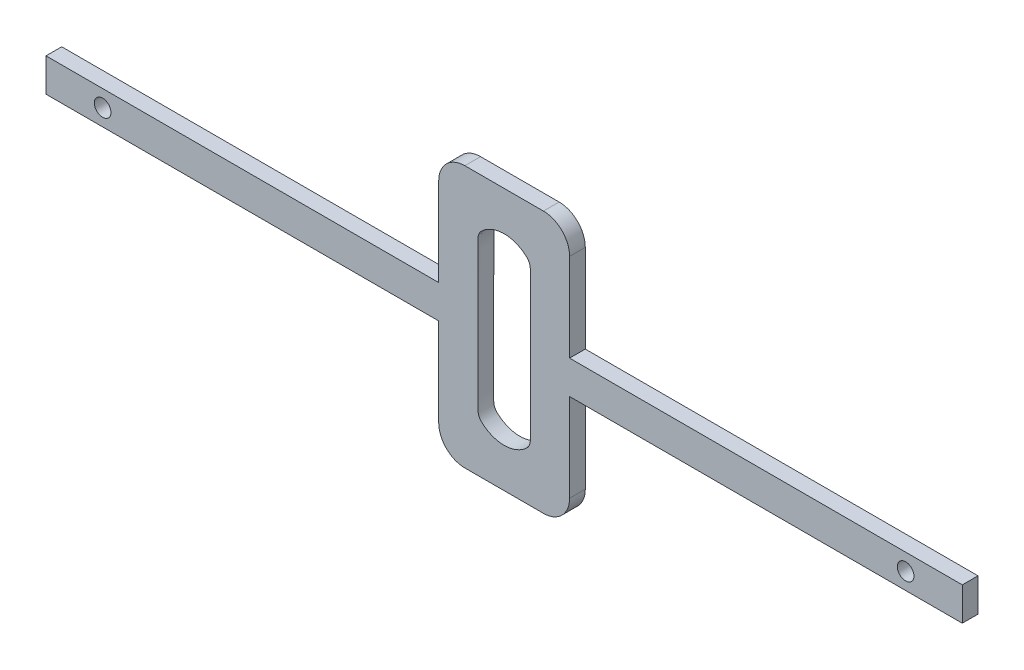
ISO-10303-21;
HEADER;
FILE_DESCRIPTION(('STEP AP214'),'2;1');
FILE_NAME('part.step','',(''),(''),'','','');
FILE_SCHEMA(('AUTOMOTIVE_DESIGN { 1 0 10303 214 1 1 1 1 }'));
ENDSEC;
DATA;
#1=APPLICATION_CONTEXT('core data for automotive mechanical design processes');
#2=APPLICATION_PROTOCOL_DEFINITION('international standard','automotive_design',2000,#1);
#3=PRODUCT_CONTEXT('',#1,'mechanical');
#4=PRODUCT('Part','Part','',(#3));
#5=PRODUCT_RELATED_PRODUCT_CATEGORY('part','',(#4));
#6=PRODUCT_DEFINITION_FORMATION('','',#4);
#7=PRODUCT_DEFINITION_CONTEXT('part definition',#1,'design');
#8=PRODUCT_DEFINITION('design','',#6,#7);
#9=PRODUCT_DEFINITION_SHAPE('','',#8);
#10=(LENGTH_UNIT() NAMED_UNIT(*) SI_UNIT(.MILLI.,.METRE.));
#11=(NAMED_UNIT(*) PLANE_ANGLE_UNIT() SI_UNIT($,.RADIAN.));
#12=(NAMED_UNIT(*) SI_UNIT($,.STERADIAN.) SOLID_ANGLE_UNIT());
#13=UNCERTAINTY_MEASURE_WITH_UNIT(LENGTH_MEASURE(1.E-05),#10,'distance_accuracy_value','');
#14=(GEOMETRIC_REPRESENTATION_CONTEXT(3) GLOBAL_UNCERTAINTY_ASSIGNED_CONTEXT((#13)) GLOBAL_UNIT_ASSIGNED_CONTEXT((#10,
#11,#12)) REPRESENTATION_CONTEXT('',''));
#15=CARTESIAN_POINT('',(0.,0.,0.));
#16=DIRECTION('',(0.,0.,1.));
#17=DIRECTION('',(1.,0.,0.));
#18=AXIS2_PLACEMENT_3D('',#15,#16,#17);
#19=CARTESIAN_POINT('',(-25.,-39.9999999999999,6.));
#20=DIRECTION('',(1.,0.,0.));
#21=DIRECTION('',(0.,0.,-1.));
#22=AXIS2_PLACEMENT_3D('',#19,#20,#21);
#23=PLANE('',#22);
#24=DIRECTION('',(0.,-1.,0.));
#25=VECTOR('',#24,1.);
#26=CARTESIAN_POINT('',(-25.,-39.9999999999999,6.));
#27=LINE('',#26,#25);
#28=CARTESIAN_POINT('',(-25.,-6.35,6.));
#29=VERTEX_POINT('',#28);
#30=CARTESIAN_POINT('',(-25.,-40.,6.));
#31=VERTEX_POINT('',#30);
#32=EDGE_CURVE('E276',#29,#31,#27,.T.);
#33=ORIENTED_EDGE('',*,*,#32,.F.);
#34=DIRECTION('',(0.,0.,-1.));
#35=VECTOR('',#34,1.);
#36=CARTESIAN_POINT('',(-25.,-6.35,6.));
#37=LINE('',#36,#35);
#38=CARTESIAN_POINT('',(-25.,-6.35,0.));
#39=VERTEX_POINT('',#38);
#40=EDGE_CURVE('E180',#29,#39,#37,.T.);
#41=ORIENTED_EDGE('',*,*,#40,.T.);
#42=DIRECTION('',(0.,-1.,0.));
#43=VECTOR('',#42,1.);
#44=CARTESIAN_POINT('',(-25.,-39.9999999999999,0.));
#45=LINE('',#44,#43);
#46=CARTESIAN_POINT('',(-25.,-40.,0.));
#47=VERTEX_POINT('',#46);
#48=EDGE_CURVE('E155',#39,#47,#45,.T.);
#49=ORIENTED_EDGE('',*,*,#48,.T.);
#50=DIRECTION('',(0.,0.,-1.));
#51=VECTOR('',#50,1.);
#52=CARTESIAN_POINT('',(-25.,-40.,6.));
#53=LINE('',#52,#51);
#54=EDGE_CURVE('E278',#31,#47,#53,.T.);
#55=ORIENTED_EDGE('',*,*,#54,.F.);
#56=EDGE_LOOP('',(#33,#41,#49,#55));
#57=FACE_BOUND('',#56,.T.);
#58=ADVANCED_FACE('F33',(#57),#23,.F.);
#59=CARTESIAN_POINT('',(25.,-39.9999999999999,6.));
#60=DIRECTION('',(-1.,0.,0.));
#61=DIRECTION('',(0.,0.,1.));
#62=AXIS2_PLACEMENT_3D('',#59,#60,#61);
#63=PLANE('',#62);
#64=DIRECTION('',(0.,0.,1.));
#65=VECTOR('',#64,1.);
#66=CARTESIAN_POINT('',(25.,6.35,6.));
#67=LINE('',#66,#65);
#68=CARTESIAN_POINT('',(25.,6.35,0.));
#69=VERTEX_POINT('',#68);
#70=CARTESIAN_POINT('',(25.,6.35,6.));
#71=VERTEX_POINT('',#70);
#72=EDGE_CURVE('E160',#69,#71,#67,.T.);
#73=ORIENTED_EDGE('',*,*,#72,.F.);
#74=DIRECTION('',(0.,1.,0.));
#75=VECTOR('',#74,1.);
#76=CARTESIAN_POINT('',(25.,-39.9999999999999,0.));
#77=LINE('',#76,#75);
#78=CARTESIAN_POINT('',(25.,39.9999999999999,0.));
#79=VERTEX_POINT('',#78);
#80=EDGE_CURVE('E314',#69,#79,#77,.T.);
#81=ORIENTED_EDGE('',*,*,#80,.T.);
#82=DIRECTION('',(0.,0.,-1.));
#83=VECTOR('',#82,1.);
#84=CARTESIAN_POINT('',(25.,39.9999999999999,6.));
#85=LINE('',#84,#83);
#86=CARTESIAN_POINT('',(25.,39.9999999999999,6.));
#87=VERTEX_POINT('',#86);
#88=EDGE_CURVE('E298',#87,#79,#85,.T.);
#89=ORIENTED_EDGE('',*,*,#88,.F.);
#90=DIRECTION('',(0.,1.,0.));
#91=VECTOR('',#90,1.);
#92=CARTESIAN_POINT('',(25.,-39.9999999999999,6.));
#93=LINE('',#92,#91);
#94=EDGE_CURVE('E56',#71,#87,#93,.T.);
#95=ORIENTED_EDGE('',*,*,#94,.F.);
#96=EDGE_LOOP('',(#73,#81,#89,#95));
#97=FACE_BOUND('',#96,.T.);
#98=ADVANCED_FACE('F242',(#97),#63,.F.);
#99=DIRECTION('',(0.,0.,-1.));
#100=VECTOR('',#99,1.);
#101=CARTESIAN_POINT('',(25.,-6.35,6.));
#102=LINE('',#101,#100);
#103=CARTESIAN_POINT('',(25.,-6.35,6.));
#104=VERTEX_POINT('',#103);
#105=CARTESIAN_POINT('',(25.,-6.35,0.));
#106=VERTEX_POINT('',#105);
#107=EDGE_CURVE('E191',#104,#106,#102,.T.);
#108=ORIENTED_EDGE('',*,*,#107,.F.);
#109=CARTESIAN_POINT('',(25.,-39.9999999999999,6.));
#110=VERTEX_POINT('',#109);
#111=EDGE_CURVE('E295',#110,#104,#93,.T.);
#112=ORIENTED_EDGE('',*,*,#111,.F.);
#113=DIRECTION('',(0.,0.,-1.));
#114=VECTOR('',#113,1.);
#115=CARTESIAN_POINT('',(25.,-39.9999999999999,6.));
#116=LINE('',#115,#114);
#117=CARTESIAN_POINT('',(25.,-39.9999999999999,0.));
#118=VERTEX_POINT('',#117);
#119=EDGE_CURVE('E320',#110,#118,#116,.T.);
#120=ORIENTED_EDGE('',*,*,#119,.T.);
#121=EDGE_CURVE('E315',#118,#106,#77,.T.);
#122=ORIENTED_EDGE('',*,*,#121,.T.);
#123=EDGE_LOOP('',(#108,#112,#120,#122));
#124=FACE_BOUND('',#123,.T.);
#125=ADVANCED_FACE('F237',(#124),#63,.F.);
#126=CARTESIAN_POINT('',(15.,40.,6.));
#127=DIRECTION('',(0.,0.,1.));
#128=DIRECTION('',(1.,0.,0.));
#129=AXIS2_PLACEMENT_3D('',#126,#127,#128);
#130=PLANE('',#129);
#131=CARTESIAN_POINT('',(153.359331414333,0.,6.));
#132=DIRECTION('',(0.,0.,1.));
#133=DIRECTION('',(-1.,0.,0.));
#134=AXIS2_PLACEMENT_3D('',#131,#132,#133);
#135=CIRCLE('',#134,3.175);
#136=CARTESIAN_POINT('',(150.184331414333,0.,6.));
#137=VERTEX_POINT('',#136);
#138=EDGE_CURVE('E524',#137,#137,#135,.T.);
#139=ORIENTED_EDGE('',*,*,#138,.F.);
#140=EDGE_LOOP('',(#139));
#141=FACE_BOUND('',#140,.T.);
#142=CARTESIAN_POINT('',(-153.359331414333,0.,6.));
#143=DIRECTION('',(0.,0.,1.));
#144=DIRECTION('',(1.,0.,0.));
#145=AXIS2_PLACEMENT_3D('',#142,#143,#144);
#146=CIRCLE('',#145,3.175);
#147=CARTESIAN_POINT('',(-150.184331414333,0.,6.));
#148=VERTEX_POINT('',#147);
#149=EDGE_CURVE('E526',#148,#148,#146,.T.);
#150=ORIENTED_EDGE('',*,*,#149,.F.);
#151=EDGE_LOOP('',(#150));
#152=FACE_BOUND('',#151,.T.);
#153=DIRECTION('',(-1.,0.,0.));
#154=VECTOR('',#153,1.);
#155=CARTESIAN_POINT('',(175.,6.35,6.));
#156=LINE('',#155,#154);
#157=CARTESIAN_POINT('',(175.,6.35,6.));
#158=VERTEX_POINT('',#157);
#159=EDGE_CURVE('E205',#158,#71,#156,.T.);
#160=ORIENTED_EDGE('',*,*,#159,.T.);
#161=ORIENTED_EDGE('',*,*,#94,.T.);
#162=CARTESIAN_POINT('',(15.,40.,6.));
#163=DIRECTION('',(0.,0.,1.));
#164=DIRECTION('',(1.,0.,0.));
#165=AXIS2_PLACEMENT_3D('',#162,#163,#164);
#166=CIRCLE('',#165,10.);
#167=CARTESIAN_POINT('',(14.9999999999999,50.,6.));
#168=VERTEX_POINT('',#167);
#169=EDGE_CURVE('E317',#87,#168,#166,.T.);
#170=ORIENTED_EDGE('',*,*,#169,.T.);
#171=DIRECTION('',(-1.,0.,0.));
#172=VECTOR('',#171,1.);
#173=CARTESIAN_POINT('',(14.9999999999999,50.,6.));
#174=LINE('',#173,#172);
#175=CARTESIAN_POINT('',(-14.9999999999999,50.,6.));
#176=VERTEX_POINT('',#175);
#177=EDGE_CURVE('E286',#168,#176,#174,.T.);
#178=ORIENTED_EDGE('',*,*,#177,.T.);
#179=CARTESIAN_POINT('',(-15.,40.,6.));
#180=DIRECTION('',(0.,0.,1.));
#181=DIRECTION('',(1.,0.,0.));
#182=AXIS2_PLACEMENT_3D('',#179,#180,#181);
#183=CIRCLE('',#182,10.);
#184=CARTESIAN_POINT('',(-25.,39.9999999999999,6.));
#185=VERTEX_POINT('',#184);
#186=EDGE_CURVE('E282',#176,#185,#183,.T.);
#187=ORIENTED_EDGE('',*,*,#186,.T.);
#188=CARTESIAN_POINT('',(-25.,6.35,6.));
#189=VERTEX_POINT('',#188);
#190=EDGE_CURVE('E281',#185,#189,#27,.T.);
#191=ORIENTED_EDGE('',*,*,#190,.T.);
#192=DIRECTION('',(1.,0.,0.));
#193=VECTOR('',#192,1.);
#194=CARTESIAN_POINT('',(-175.,6.35,6.));
#195=LINE('',#194,#193);
#196=CARTESIAN_POINT('',(-175.,6.35,6.));
#197=VERTEX_POINT('',#196);
#198=EDGE_CURVE('E48',#197,#189,#195,.T.);
#199=ORIENTED_EDGE('',*,*,#198,.F.);
#200=DIRECTION('',(0.,-1.,0.));
#201=VECTOR('',#200,1.);
#202=CARTESIAN_POINT('',(-175.,-6.35,6.));
#203=LINE('',#202,#201);
#204=CARTESIAN_POINT('',(-175.,-6.35,6.));
#205=VERTEX_POINT('',#204);
#206=EDGE_CURVE('E173',#197,#205,#203,.T.);
#207=ORIENTED_EDGE('',*,*,#206,.T.);
#208=DIRECTION('',(1.,0.,0.));
#209=VECTOR('',#208,1.);
#210=CARTESIAN_POINT('',(-175.,-6.35,6.));
#211=LINE('',#210,#209);
#212=EDGE_CURVE('E161',#205,#29,#211,.T.);
#213=ORIENTED_EDGE('',*,*,#212,.T.);
#214=ORIENTED_EDGE('',*,*,#32,.T.);
#215=CARTESIAN_POINT('',(-15.,-40.,6.));
#216=DIRECTION('',(0.,0.,1.));
#217=DIRECTION('',(-1.,0.,0.));
#218=AXIS2_PLACEMENT_3D('',#215,#216,#217);
#219=CIRCLE('',#218,10.);
#220=CARTESIAN_POINT('',(-14.9999999999999,-50.,6.));
#221=VERTEX_POINT('',#220);
#222=EDGE_CURVE('E285',#31,#221,#219,.T.);
#223=ORIENTED_EDGE('',*,*,#222,.T.);
#224=DIRECTION('',(1.,0.,0.));
#225=VECTOR('',#224,1.);
#226=CARTESIAN_POINT('',(14.9999999999999,-50.,6.));
#227=LINE('',#226,#225);
#228=CARTESIAN_POINT('',(14.9999999999999,-50.,6.));
#229=VERTEX_POINT('',#228);
#230=EDGE_CURVE('E291',#221,#229,#227,.T.);
#231=ORIENTED_EDGE('',*,*,#230,.T.);
#232=CARTESIAN_POINT('',(15.,-40.,6.));
#233=DIRECTION('',(0.,0.,1.));
#234=DIRECTION('',(1.,0.,0.));
#235=AXIS2_PLACEMENT_3D('',#232,#233,#234);
#236=CIRCLE('',#235,10.);
#237=EDGE_CURVE('E293',#229,#110,#236,.T.);
#238=ORIENTED_EDGE('',*,*,#237,.T.);
#239=ORIENTED_EDGE('',*,*,#111,.T.);
#240=DIRECTION('',(-1.,0.,0.));
#241=VECTOR('',#240,1.);
#242=CARTESIAN_POINT('',(175.,-6.35,6.));
#243=LINE('',#242,#241);
#244=CARTESIAN_POINT('',(175.,-6.35,6.));
#245=VERTEX_POINT('',#244);
#246=EDGE_CURVE('E202',#245,#104,#243,.T.);
#247=ORIENTED_EDGE('',*,*,#246,.F.);
#248=DIRECTION('',(0.,-1.,0.));
#249=VECTOR('',#248,1.);
#250=CARTESIAN_POINT('',(175.,-6.35,6.));
#251=LINE('',#250,#249);
#252=EDGE_CURVE('E193',#158,#245,#251,.T.);
#253=ORIENTED_EDGE('',*,*,#252,.F.);
#254=EDGE_LOOP('',(#160,#161,#170,#178,#187,#191,#199,#207,#213,#214,#223,#231,#238,#239,#247,#253));
#255=FACE_BOUND('',#254,.T.);
#256=CARTESIAN_POINT('',(-10.,-24.256176986316,6.));
#257=CARTESIAN_POINT('',(-10.,-24.6546797502891,6.));
#258=CARTESIAN_POINT('',(-10.,-25.4516852782352,6.));
#259=CARTESIAN_POINT('',(-10.,-26.6471935701544,6.));
#260=CARTESIAN_POINT('',(-10.,-27.4441990981005,6.));
#261=CARTESIAN_POINT('',(-10.,-27.8427018620735,6.));
#262=CARTESIAN_POINT('',(-10.,-28.3645798623704,6.));
#263=CARTESIAN_POINT('',(-10.,-29.4083358629641,6.));
#264=CARTESIAN_POINT('',(-9.21136120348822,-31.0937206496149,6.));
#265=CARTESIAN_POINT('',(-8.41001572821081,-31.7625046341927,6.));
#266=CARTESIAN_POINT('',(-8.0093429905721,-32.0968966264816,6.));
#267=CARTESIAN_POINT('',(-7.76269737408092,-32.3027412256771,6.));
#268=CARTESIAN_POINT('',(-7.26940614109857,-32.7144304240682,6.));
#269=CARTESIAN_POINT('',(-6.44111569163193,-33.2271739218832,6.));
#270=CARTESIAN_POINT('',(-5.87751093860023,-33.5366693900736,6.));
#271=CARTESIAN_POINT('',(-5.59016994374948,-33.680339887499,6.));
#272=CARTESIAN_POINT('',(-2.00446820738661,-35.4731907556804,6.));
#273=CARTESIAN_POINT('',(2.0044682073866,-35.4731907556804,6.));
#274=CARTESIAN_POINT('',(5.59016994374947,-33.680339887499,6.));
#275=CARTESIAN_POINT('',(5.87751093860022,-33.5366693900736,5.99999999999997));
#276=CARTESIAN_POINT('',(6.44111569163192,-33.2271739218832,5.99999999999997));
#277=CARTESIAN_POINT('',(7.26940614109856,-32.7144304240682,5.99999999999998));
#278=CARTESIAN_POINT('',(7.76269737408092,-32.3027412256771,5.99999999999998));
#279=CARTESIAN_POINT('',(8.00934299057209,-32.0968966264816,5.99999999999998));
#280=CARTESIAN_POINT('',(8.4100157282108,-31.7625046341927,5.99999999999998));
#281=CARTESIAN_POINT('',(9.21136120348822,-31.0937206496149,5.99999999999999));
#282=CARTESIAN_POINT('',(10.,-29.4083358629641,6.));
#283=CARTESIAN_POINT('',(10.,-28.3645798623704,6.00000000000001));
#284=CARTESIAN_POINT('',(10.,-27.8427018620735,6.00000000000001));
#285=CARTESIAN_POINT('',(10.,-27.4441990981005,6.00000000000002));
#286=CARTESIAN_POINT('',(10.,-26.6471935701544,6.00000000000002));
#287=CARTESIAN_POINT('',(10.,-25.4516852782352,6.00000000000003));
#288=CARTESIAN_POINT('',(10.,-24.6546797502891,6.00000000000003));
#289=CARTESIAN_POINT('',(10.,-24.256176986316,6.00000000000004));
#290=CARTESIAN_POINT('',(10.,-8.085392328772,6.));
#291=CARTESIAN_POINT('',(10.,8.085392328772,6.));
#292=CARTESIAN_POINT('',(10.,24.256176986316,6.));
#293=CARTESIAN_POINT('',(10.,24.6546797502891,6.));
#294=CARTESIAN_POINT('',(10.,25.4516852782352,6.));
#295=CARTESIAN_POINT('',(10.,26.6471935701544,6.));
#296=CARTESIAN_POINT('',(10.,27.4441990981005,6.));
#297=CARTESIAN_POINT('',(10.,27.8427018620735,6.));
#298=CARTESIAN_POINT('',(10.,28.3645798623704,6.));
#299=CARTESIAN_POINT('',(10.,29.4083358629641,6.));
#300=CARTESIAN_POINT('',(9.21136120348822,31.0937206496149,6.));
#301=CARTESIAN_POINT('',(8.4100157282108,31.7625046341927,6.));
#302=CARTESIAN_POINT('',(8.00934299057209,32.0968966264816,6.));
#303=CARTESIAN_POINT('',(7.76269737408092,32.3027412256771,6.));
#304=CARTESIAN_POINT('',(7.26940614109857,32.7144304240682,6.));
#305=CARTESIAN_POINT('',(6.44111569163192,33.2271739218832,6.));
#306=CARTESIAN_POINT('',(5.87751093860023,33.5366693900736,6.));
#307=CARTESIAN_POINT('',(5.59016994374947,33.680339887499,6.));
#308=CARTESIAN_POINT('',(2.0044682073866,35.4731907556804,6.));
#309=CARTESIAN_POINT('',(-2.0044682073866,35.4731907556804,6.));
#310=CARTESIAN_POINT('',(-5.59016994374947,33.680339887499,6.));
#311=CARTESIAN_POINT('',(-5.87751093860023,33.5366693900736,5.99999999999997));
#312=CARTESIAN_POINT('',(-6.44111569163192,33.2271739218832,5.99999999999997));
#313=CARTESIAN_POINT('',(-7.26940614109857,32.7144304240682,5.99999999999998));
#314=CARTESIAN_POINT('',(-7.76269737408092,32.3027412256771,5.99999999999998));
#315=CARTESIAN_POINT('',(-8.00934299057209,32.0968966264816,5.99999999999998));
#316=CARTESIAN_POINT('',(-8.4100157282108,31.7625046341927,5.99999999999998));
#317=CARTESIAN_POINT('',(-9.21136120348822,31.0937206496149,5.99999999999999));
#318=CARTESIAN_POINT('',(-10.,29.4083358629641,6.));
#319=CARTESIAN_POINT('',(-10.,28.3645798623704,6.00000000000001));
#320=CARTESIAN_POINT('',(-10.,27.8427018620735,6.00000000000001));
#321=CARTESIAN_POINT('',(-10.,27.4441990981005,6.00000000000002));
#322=CARTESIAN_POINT('',(-10.,26.6471935701544,6.00000000000002));
#323=CARTESIAN_POINT('',(-10.,25.4516852782352,6.00000000000003));
#324=CARTESIAN_POINT('',(-10.,24.6546797502891,6.00000000000003));
#325=CARTESIAN_POINT('',(-10.,24.256176986316,6.00000000000004));
#326=CARTESIAN_POINT('',(-10.,8.085392328772,6.));
#327=CARTESIAN_POINT('',(-10.,-8.085392328772,6.));
#328=CARTESIAN_POINT('',(-10.,-24.256176986316,6.));
#329=(BOUNDED_CURVE() B_SPLINE_CURVE(3,(#256,#257,#258,#259,#260,#261,#262,#263,#264,#265,#266,
#267,#268,#269,#270,#271,#272,#273,#274,#275,#276,#277,#278,#279,#280,#281,#282,#283,#284,#285,
#286,#287,#288,#289,#290,#291,#292,#293,#294,#295,#296,#297,#298,#299,#300,#301,#302,#303,#304,
#305,#306,#307,#308,#309,#310,#311,#312,#313,#314,#315,#316,#317,#318,#319,#320,#321,#322,#323,
#324,#325,#326,#327,#328),.UNSPECIFIED.,.T.,.F.) B_SPLINE_CURVE_WITH_KNOTS((4,1,1,3,1,1,3,1,1,3,
3,1,1,3,1,1,3,1,1,3,3,1,1,3,1,1,3,1,1,3,3,1,1,3,1,1,3,1,1,3,4),(0.,0.00728593746105777,
0.0145718749221154,0.0218578123831732,0.0313994537875019,0.0409410951918304,0.0504827365961591,
0.0563563681299084,0.0622299996636576,0.0681036311974069,0.136241391315254,0.142115022849003,
0.147988654382753,0.153862285916502,0.163403927320831,0.172945568725159,0.182487210129488,
0.189773147590546,0.197059085051604,0.204345022512661,0.5,0.507285937461058,0.514571874922116,
0.521857812383173,0.531399453787502,0.540941095191831,0.550482736596159,0.556356368129909,
0.562229999663658,0.568103631197407,0.636241391315254,0.642115022849004,0.647988654382753,
0.653862285916502,0.663403927320831,0.672945568725159,0.682487210129488,0.689773147590546,
0.697059085051604,0.704345022512661,1.),
.UNSPECIFIED.) CURVE() GEOMETRIC_REPRESENTATION_ITEM() RATIONAL_B_SPLINE_CURVE((1.,1.,1.,1.,1.,
1.,1.,1.,1.,1.,1.,1.,1.,1.,1.,1.,0.929618127333277,0.929618127333277,1.,1.,1.,1.,1.,1.,1.,1.,1.,
1.,1.,1.,1.,1.,1.,1.,1.,1.,1.,1.,1.,1.,1.,1.,1.,1.,1.,1.,1.,1.,1.,1.,1.,1.,0.929618127333277,
0.929618127333277,1.,1.,1.,1.,1.,1.,1.,1.,1.,1.,1.,1.,1.,1.,1.,1.,1.,1.,1.)) REPRESENTATION_ITEM(''));
#330=CARTESIAN_POINT('',(-10.,-24.256176986316,6.));
#331=VERTEX_POINT('',#330);
#332=EDGE_CURVE('E212',#331,#331,#329,.T.);
#333=ORIENTED_EDGE('',*,*,#332,.F.);
#334=EDGE_LOOP('',(#333));
#335=FACE_BOUND('',#334,.T.);
#336=ADVANCED_FACE('F234',(#141,#152,#255,#335),#130,.T.);
#337=CARTESIAN_POINT('',(15.,40.,0.));
#338=DIRECTION('',(0.,0.,1.));
#339=DIRECTION('',(1.,0.,0.));
#340=AXIS2_PLACEMENT_3D('',#337,#338,#339);
#341=PLANE('',#340);
#342=CARTESIAN_POINT('',(153.359331414333,0.,0.));
#343=DIRECTION('',(0.,0.,1.));
#344=DIRECTION('',(-1.,0.,0.));
#345=AXIS2_PLACEMENT_3D('',#342,#343,#344);
#346=CIRCLE('',#345,3.175);
#347=CARTESIAN_POINT('',(150.184331414333,0.,0.));
#348=VERTEX_POINT('',#347);
#349=EDGE_CURVE('E521',#348,#348,#346,.T.);
#350=ORIENTED_EDGE('',*,*,#349,.T.);
#351=EDGE_LOOP('',(#350));
#352=FACE_BOUND('',#351,.T.);
#353=CARTESIAN_POINT('',(-153.359331414333,0.,0.));
#354=DIRECTION('',(0.,0.,1.));
#355=DIRECTION('',(1.,0.,0.));
#356=AXIS2_PLACEMENT_3D('',#353,#354,#355);
#357=CIRCLE('',#356,3.175);
#358=CARTESIAN_POINT('',(-150.184331414333,0.,0.));
#359=VERTEX_POINT('',#358);
#360=EDGE_CURVE('E182',#359,#359,#357,.T.);
#361=ORIENTED_EDGE('',*,*,#360,.T.);
#362=EDGE_LOOP('',(#361));
#363=FACE_BOUND('',#362,.T.);
#364=DIRECTION('',(-1.,0.,0.));
#365=VECTOR('',#364,1.);
#366=CARTESIAN_POINT('',(175.,-6.35,0.));
#367=LINE('',#366,#365);
#368=CARTESIAN_POINT('',(175.,-6.35,0.));
#369=VERTEX_POINT('',#368);
#370=EDGE_CURVE('E197',#369,#106,#367,.T.);
#371=ORIENTED_EDGE('',*,*,#370,.T.);
#372=ORIENTED_EDGE('',*,*,#121,.F.);
#373=CARTESIAN_POINT('',(15.,-40.,0.));
#374=DIRECTION('',(0.,0.,1.));
#375=DIRECTION('',(1.,0.,0.));
#376=AXIS2_PLACEMENT_3D('',#373,#374,#375);
#377=CIRCLE('',#376,10.);
#378=CARTESIAN_POINT('',(14.9999999999999,-50.,0.));
#379=VERTEX_POINT('',#378);
#380=EDGE_CURVE('E312',#379,#118,#377,.T.);
#381=ORIENTED_EDGE('',*,*,#380,.F.);
#382=DIRECTION('',(1.,0.,0.));
#383=VECTOR('',#382,1.);
#384=CARTESIAN_POINT('',(14.9999999999999,-50.,0.));
#385=LINE('',#384,#383);
#386=CARTESIAN_POINT('',(-14.9999999999999,-50.,0.));
#387=VERTEX_POINT('',#386);
#388=EDGE_CURVE('E310',#387,#379,#385,.T.);
#389=ORIENTED_EDGE('',*,*,#388,.F.);
#390=CARTESIAN_POINT('',(-15.,-40.,0.));
#391=DIRECTION('',(0.,0.,1.));
#392=DIRECTION('',(-1.,0.,0.));
#393=AXIS2_PLACEMENT_3D('',#390,#391,#392);
#394=CIRCLE('',#393,10.);
#395=EDGE_CURVE('E308',#47,#387,#394,.T.);
#396=ORIENTED_EDGE('',*,*,#395,.F.);
#397=ORIENTED_EDGE('',*,*,#48,.F.);
#398=DIRECTION('',(1.,0.,0.));
#399=VECTOR('',#398,1.);
#400=CARTESIAN_POINT('',(-175.,-6.35,0.));
#401=LINE('',#400,#399);
#402=CARTESIAN_POINT('',(-175.,-6.35,0.));
#403=VERTEX_POINT('',#402);
#404=EDGE_CURVE('E147',#403,#39,#401,.T.);
#405=ORIENTED_EDGE('',*,*,#404,.F.);
#406=DIRECTION('',(0.,1.,0.));
#407=VECTOR('',#406,1.);
#408=CARTESIAN_POINT('',(-175.,-6.35,0.));
#409=LINE('',#408,#407);
#410=CARTESIAN_POINT('',(-175.,6.35,0.));
#411=VERTEX_POINT('',#410);
#412=EDGE_CURVE('E152',#403,#411,#409,.T.);
#413=ORIENTED_EDGE('',*,*,#412,.T.);
#414=DIRECTION('',(1.,0.,0.));
#415=VECTOR('',#414,1.);
#416=CARTESIAN_POINT('',(-175.,6.35,0.));
#417=LINE('',#416,#415);
#418=CARTESIAN_POINT('',(-25.,6.35,0.));
#419=VERTEX_POINT('',#418);
#420=EDGE_CURVE('E179',#411,#419,#417,.T.);
#421=ORIENTED_EDGE('',*,*,#420,.T.);
#422=CARTESIAN_POINT('',(-25.,39.9999999999999,0.));
#423=VERTEX_POINT('',#422);
#424=EDGE_CURVE('E305',#423,#419,#45,.T.);
#425=ORIENTED_EDGE('',*,*,#424,.F.);
#426=CARTESIAN_POINT('',(-15.,40.,0.));
#427=DIRECTION('',(0.,0.,1.));
#428=DIRECTION('',(1.,0.,0.));
#429=AXIS2_PLACEMENT_3D('',#426,#427,#428);
#430=CIRCLE('',#429,10.);
#431=CARTESIAN_POINT('',(-14.9999999999999,50.,0.));
#432=VERTEX_POINT('',#431);
#433=EDGE_CURVE('E303',#432,#423,#430,.T.);
#434=ORIENTED_EDGE('',*,*,#433,.F.);
#435=DIRECTION('',(-1.,0.,0.));
#436=VECTOR('',#435,1.);
#437=CARTESIAN_POINT('',(14.9999999999999,50.,0.));
#438=LINE('',#437,#436);
#439=CARTESIAN_POINT('',(14.9999999999999,50.,0.));
#440=VERTEX_POINT('',#439);
#441=EDGE_CURVE('E301',#440,#432,#438,.T.);
#442=ORIENTED_EDGE('',*,*,#441,.F.);
#443=CARTESIAN_POINT('',(15.,40.,0.));
#444=DIRECTION('',(0.,0.,1.));
#445=DIRECTION('',(1.,0.,0.));
#446=AXIS2_PLACEMENT_3D('',#443,#444,#445);
#447=CIRCLE('',#446,10.);
#448=EDGE_CURVE('E218',#79,#440,#447,.T.);
#449=ORIENTED_EDGE('',*,*,#448,.F.);
#450=ORIENTED_EDGE('',*,*,#80,.F.);
#451=DIRECTION('',(-1.,0.,0.));
#452=VECTOR('',#451,1.);
#453=CARTESIAN_POINT('',(175.,6.35,0.));
#454=LINE('',#453,#452);
#455=CARTESIAN_POINT('',(175.,6.35,0.));
#456=VERTEX_POINT('',#455);
#457=EDGE_CURVE('E208',#456,#69,#454,.T.);
#458=ORIENTED_EDGE('',*,*,#457,.F.);
#459=DIRECTION('',(0.,1.,0.));
#460=VECTOR('',#459,1.);
#461=CARTESIAN_POINT('',(175.,-6.35,0.));
#462=LINE('',#461,#460);
#463=EDGE_CURVE('E187',#369,#456,#462,.T.);
#464=ORIENTED_EDGE('',*,*,#463,.F.);
#465=EDGE_LOOP('',(#371,#372,#381,#389,#396,#397,#405,#413,#421,#425,#434,#442,#449,#450,#458,#464));
#466=FACE_BOUND('',#465,.T.);
#467=CARTESIAN_POINT('',(-10.,-24.256176986316,0.));
#468=CARTESIAN_POINT('',(-10.,-24.6546797502891,0.));
#469=CARTESIAN_POINT('',(-10.,-25.4516852782352,0.));
#470=CARTESIAN_POINT('',(-10.,-26.6471935701544,0.));
#471=CARTESIAN_POINT('',(-10.,-27.4441990981005,0.));
#472=CARTESIAN_POINT('',(-10.,-27.8427018620735,0.));
#473=CARTESIAN_POINT('',(-10.,-28.3645798623704,0.));
#474=CARTESIAN_POINT('',(-10.,-29.4083358629641,0.));
#475=CARTESIAN_POINT('',(-9.21136120348822,-31.0937206496149,0.));
#476=CARTESIAN_POINT('',(-8.41001572821081,-31.7625046341927,0.));
#477=CARTESIAN_POINT('',(-8.0093429905721,-32.0968966264816,0.));
#478=CARTESIAN_POINT('',(-7.76269737408092,-32.3027412256771,0.));
#479=CARTESIAN_POINT('',(-7.26940614109857,-32.7144304240682,0.));
#480=CARTESIAN_POINT('',(-6.44111569163193,-33.2271739218832,0.));
#481=CARTESIAN_POINT('',(-5.87751093860023,-33.5366693900736,0.));
#482=CARTESIAN_POINT('',(-5.59016994374948,-33.680339887499,0.));
#483=CARTESIAN_POINT('',(-2.00446820738661,-35.4731907556804,0.));
#484=CARTESIAN_POINT('',(2.0044682073866,-35.4731907556804,0.));
#485=CARTESIAN_POINT('',(5.59016994374947,-33.680339887499,0.));
#486=CARTESIAN_POINT('',(5.87751093860022,-33.5366693900736,0.));
#487=CARTESIAN_POINT('',(6.44111569163192,-33.2271739218832,0.));
#488=CARTESIAN_POINT('',(7.26940614109856,-32.7144304240682,0.));
#489=CARTESIAN_POINT('',(7.76269737408092,-32.3027412256771,0.));
#490=CARTESIAN_POINT('',(8.00934299057209,-32.0968966264816,0.));
#491=CARTESIAN_POINT('',(8.4100157282108,-31.7625046341927,0.));
#492=CARTESIAN_POINT('',(9.21136120348822,-31.0937206496149,0.));
#493=CARTESIAN_POINT('',(10.,-29.4083358629641,0.));
#494=CARTESIAN_POINT('',(10.,-28.3645798623704,0.));
#495=CARTESIAN_POINT('',(10.,-27.8427018620735,0.));
#496=CARTESIAN_POINT('',(10.,-27.4441990981005,0.));
#497=CARTESIAN_POINT('',(10.,-26.6471935701544,0.));
#498=CARTESIAN_POINT('',(10.,-25.4516852782352,0.));
#499=CARTESIAN_POINT('',(10.,-24.6546797502891,0.));
#500=CARTESIAN_POINT('',(10.,-24.256176986316,0.));
#501=CARTESIAN_POINT('',(10.,-8.085392328772,0.));
#502=CARTESIAN_POINT('',(10.,8.085392328772,0.));
#503=CARTESIAN_POINT('',(10.,24.256176986316,0.));
#504=CARTESIAN_POINT('',(10.,24.6546797502891,0.));
#505=CARTESIAN_POINT('',(10.,25.4516852782352,0.));
#506=CARTESIAN_POINT('',(10.,26.6471935701544,0.));
#507=CARTESIAN_POINT('',(10.,27.4441990981005,0.));
#508=CARTESIAN_POINT('',(10.,27.8427018620735,0.));
#509=CARTESIAN_POINT('',(10.,28.3645798623704,0.));
#510=CARTESIAN_POINT('',(10.,29.4083358629641,0.));
#511=CARTESIAN_POINT('',(9.21136120348822,31.0937206496149,0.));
#512=CARTESIAN_POINT('',(8.4100157282108,31.7625046341927,0.));
#513=CARTESIAN_POINT('',(8.00934299057209,32.0968966264816,0.));
#514=CARTESIAN_POINT('',(7.76269737408092,32.3027412256771,0.));
#515=CARTESIAN_POINT('',(7.26940614109857,32.7144304240682,0.));
#516=CARTESIAN_POINT('',(6.44111569163192,33.2271739218832,0.));
#517=CARTESIAN_POINT('',(5.87751093860023,33.5366693900736,0.));
#518=CARTESIAN_POINT('',(5.59016994374947,33.680339887499,0.));
#519=CARTESIAN_POINT('',(2.0044682073866,35.4731907556804,0.));
#520=CARTESIAN_POINT('',(-2.0044682073866,35.4731907556804,0.));
#521=CARTESIAN_POINT('',(-5.59016994374947,33.680339887499,0.));
#522=CARTESIAN_POINT('',(-5.87751093860023,33.5366693900736,0.));
#523=CARTESIAN_POINT('',(-6.44111569163192,33.2271739218832,0.));
#524=CARTESIAN_POINT('',(-7.26940614109857,32.7144304240682,0.));
#525=CARTESIAN_POINT('',(-7.76269737408092,32.3027412256771,0.));
#526=CARTESIAN_POINT('',(-8.00934299057209,32.0968966264816,0.));
#527=CARTESIAN_POINT('',(-8.4100157282108,31.7625046341927,0.));
#528=CARTESIAN_POINT('',(-9.21136120348822,31.0937206496149,0.));
#529=CARTESIAN_POINT('',(-10.,29.4083358629641,0.));
#530=CARTESIAN_POINT('',(-10.,28.3645798623704,0.));
#531=CARTESIAN_POINT('',(-10.,27.8427018620735,0.));
#532=CARTESIAN_POINT('',(-10.,27.4441990981005,0.));
#533=CARTESIAN_POINT('',(-10.,26.6471935701544,0.));
#534=CARTESIAN_POINT('',(-10.,25.4516852782352,0.));
#535=CARTESIAN_POINT('',(-10.,24.6546797502891,0.));
#536=CARTESIAN_POINT('',(-10.,24.256176986316,0.));
#537=CARTESIAN_POINT('',(-10.,8.085392328772,0.));
#538=CARTESIAN_POINT('',(-10.,-8.085392328772,0.));
#539=CARTESIAN_POINT('',(-10.,-24.256176986316,0.));
#540=(BOUNDED_CURVE() B_SPLINE_CURVE(3,(#467,#468,#469,#470,#471,#472,#473,#474,#475,#476,#477,
#478,#479,#480,#481,#482,#483,#484,#485,#486,#487,#488,#489,#490,#491,#492,#493,#494,#495,#496,
#497,#498,#499,#500,#501,#502,#503,#504,#505,#506,#507,#508,#509,#510,#511,#512,#513,#514,#515,
#516,#517,#518,#519,#520,#521,#522,#523,#524,#525,#526,#527,#528,#529,#530,#531,#532,#533,#534,
#535,#536,#537,#538,#539),.UNSPECIFIED.,.T.,.F.) B_SPLINE_CURVE_WITH_KNOTS((4,1,1,3,1,1,3,1,1,3,
3,1,1,3,1,1,3,1,1,3,3,1,1,3,1,1,3,1,1,3,3,1,1,3,1,1,3,1,1,3,4),(0.,0.00728593746105777,
0.0145718749221154,0.0218578123831732,0.0313994537875019,0.0409410951918304,0.0504827365961591,
0.0563563681299084,0.0622299996636576,0.0681036311974069,0.136241391315254,0.142115022849003,
0.147988654382753,0.153862285916502,0.163403927320831,0.172945568725159,0.182487210129488,
0.189773147590546,0.197059085051604,0.204345022512661,0.5,0.507285937461058,0.514571874922116,
0.521857812383173,0.531399453787502,0.540941095191831,0.550482736596159,0.556356368129909,
0.562229999663658,0.568103631197407,0.636241391315254,0.642115022849004,0.647988654382753,
0.653862285916502,0.663403927320831,0.672945568725159,0.682487210129488,0.689773147590546,
0.697059085051604,0.704345022512661,1.),
.UNSPECIFIED.) CURVE() GEOMETRIC_REPRESENTATION_ITEM() RATIONAL_B_SPLINE_CURVE((1.,1.,1.,1.,1.,
1.,1.,1.,1.,1.,1.,1.,1.,1.,1.,1.,0.929618127333277,0.929618127333277,1.,1.,1.,1.,1.,1.,1.,1.,1.,
1.,1.,1.,1.,1.,1.,1.,1.,1.,1.,1.,1.,1.,1.,1.,1.,1.,1.,1.,1.,1.,1.,1.,1.,1.,0.929618127333277,
0.929618127333277,1.,1.,1.,1.,1.,1.,1.,1.,1.,1.,1.,1.,1.,1.,1.,1.,1.,1.,1.)) REPRESENTATION_ITEM(''));
#541=CARTESIAN_POINT('',(-10.,-24.256176986316,0.));
#542=VERTEX_POINT('',#541);
#543=EDGE_CURVE('E211',#542,#542,#540,.T.);
#544=ORIENTED_EDGE('',*,*,#543,.T.);
#545=EDGE_LOOP('',(#544));
#546=FACE_BOUND('',#545,.T.);
#547=ADVANCED_FACE('F150',(#352,#363,#466,#546),#341,.F.);
#548=CARTESIAN_POINT('',(15.,40.,6.));
#549=DIRECTION('',(0.,0.,-1.));
#550=DIRECTION('',(-1.,0.,0.));
#551=AXIS2_PLACEMENT_3D('',#548,#549,#550);
#552=CYLINDRICAL_SURFACE('',#551,10.);
#553=ORIENTED_EDGE('',*,*,#448,.T.);
#554=DIRECTION('',(0.,0.,-1.));
#555=VECTOR('',#554,1.);
#556=CARTESIAN_POINT('',(14.9999999999999,50.,6.));
#557=LINE('',#556,#555);
#558=EDGE_CURVE('E11',#168,#440,#557,.T.);
#559=ORIENTED_EDGE('',*,*,#558,.F.);
#560=ORIENTED_EDGE('',*,*,#169,.F.);
#561=ORIENTED_EDGE('',*,*,#88,.T.);
#562=EDGE_LOOP('',(#553,#559,#560,#561));
#563=FACE_BOUND('',#562,.T.);
#564=ADVANCED_FACE('F35',(#563),#552,.T.);
#565=CARTESIAN_POINT('',(14.9999999999999,50.,6.));
#566=DIRECTION('',(0.,-1.,0.));
#567=DIRECTION('',(1.,0.,0.));
#568=AXIS2_PLACEMENT_3D('',#565,#566,#567);
#569=PLANE('',#568);
#570=ORIENTED_EDGE('',*,*,#441,.T.);
#571=DIRECTION('',(0.,0.,-1.));
#572=VECTOR('',#571,1.);
#573=CARTESIAN_POINT('',(-14.9999999999999,50.,6.));
#574=LINE('',#573,#572);
#575=EDGE_CURVE('E41',#176,#432,#574,.T.);
#576=ORIENTED_EDGE('',*,*,#575,.F.);
#577=ORIENTED_EDGE('',*,*,#177,.F.);
#578=ORIENTED_EDGE('',*,*,#558,.T.);
#579=EDGE_LOOP('',(#570,#576,#577,#578));
#580=FACE_BOUND('',#579,.T.);
#581=ADVANCED_FACE('F262',(#580),#569,.F.);
#582=CARTESIAN_POINT('',(-15.,40.,6.));
#583=DIRECTION('',(0.,0.,-1.));
#584=DIRECTION('',(-1.,0.,0.));
#585=AXIS2_PLACEMENT_3D('',#582,#583,#584);
#586=CYLINDRICAL_SURFACE('',#585,10.);
#587=ORIENTED_EDGE('',*,*,#433,.T.);
#588=DIRECTION('',(0.,0.,-1.));
#589=VECTOR('',#588,1.);
#590=CARTESIAN_POINT('',(-25.,39.9999999999999,6.));
#591=LINE('',#590,#589);
#592=EDGE_CURVE('E330',#185,#423,#591,.T.);
#593=ORIENTED_EDGE('',*,*,#592,.F.);
#594=ORIENTED_EDGE('',*,*,#186,.F.);
#595=ORIENTED_EDGE('',*,*,#575,.T.);
#596=EDGE_LOOP('',(#587,#593,#594,#595));
#597=FACE_BOUND('',#596,.T.);
#598=ADVANCED_FACE('F259',(#597),#586,.T.);
#599=ORIENTED_EDGE('',*,*,#424,.T.);
#600=DIRECTION('',(0.,0.,1.));
#601=VECTOR('',#600,1.);
#602=CARTESIAN_POINT('',(-25.,6.35,6.));
#603=LINE('',#602,#601);
#604=EDGE_CURVE('E170',#419,#189,#603,.T.);
#605=ORIENTED_EDGE('',*,*,#604,.T.);
#606=ORIENTED_EDGE('',*,*,#190,.F.);
#607=ORIENTED_EDGE('',*,*,#592,.T.);
#608=EDGE_LOOP('',(#599,#605,#606,#607));
#609=FACE_BOUND('',#608,.T.);
#610=ADVANCED_FACE('F255',(#609),#23,.F.);
#611=CARTESIAN_POINT('',(-15.,-40.,6.));
#612=DIRECTION('',(0.,0.,-1.));
#613=DIRECTION('',(-1.,0.,0.));
#614=AXIS2_PLACEMENT_3D('',#611,#612,#613);
#615=CYLINDRICAL_SURFACE('',#614,10.);
#616=ORIENTED_EDGE('',*,*,#395,.T.);
#617=DIRECTION('',(0.,0.,-1.));
#618=VECTOR('',#617,1.);
#619=CARTESIAN_POINT('',(-14.9999999999999,-50.,6.));
#620=LINE('',#619,#618);
#621=EDGE_CURVE('E326',#221,#387,#620,.T.);
#622=ORIENTED_EDGE('',*,*,#621,.F.);
#623=ORIENTED_EDGE('',*,*,#222,.F.);
#624=ORIENTED_EDGE('',*,*,#54,.T.);
#625=EDGE_LOOP('',(#616,#622,#623,#624));
#626=FACE_BOUND('',#625,.T.);
#627=ADVANCED_FACE('F251',(#626),#615,.T.);
#628=CARTESIAN_POINT('',(14.9999999999999,-50.,6.));
#629=DIRECTION('',(0.,1.,0.));
#630=DIRECTION('',(-1.,0.,0.));
#631=AXIS2_PLACEMENT_3D('',#628,#629,#630);
#632=PLANE('',#631);
#633=ORIENTED_EDGE('',*,*,#388,.T.);
#634=DIRECTION('',(0.,0.,-1.));
#635=VECTOR('',#634,1.);
#636=CARTESIAN_POINT('',(14.9999999999999,-50.,6.));
#637=LINE('',#636,#635);
#638=EDGE_CURVE('E323',#229,#379,#637,.T.);
#639=ORIENTED_EDGE('',*,*,#638,.F.);
#640=ORIENTED_EDGE('',*,*,#230,.F.);
#641=ORIENTED_EDGE('',*,*,#621,.T.);
#642=EDGE_LOOP('',(#633,#639,#640,#641));
#643=FACE_BOUND('',#642,.T.);
#644=ADVANCED_FACE('F247',(#643),#632,.F.);
#645=CARTESIAN_POINT('',(15.,-40.,6.));
#646=DIRECTION('',(0.,0.,-1.));
#647=DIRECTION('',(-1.,0.,0.));
#648=AXIS2_PLACEMENT_3D('',#645,#646,#647);
#649=CYLINDRICAL_SURFACE('',#648,10.);
#650=ORIENTED_EDGE('',*,*,#380,.T.);
#651=ORIENTED_EDGE('',*,*,#119,.F.);
#652=ORIENTED_EDGE('',*,*,#237,.F.);
#653=ORIENTED_EDGE('',*,*,#638,.T.);
#654=EDGE_LOOP('',(#650,#651,#652,#653));
#655=FACE_BOUND('',#654,.T.);
#656=ADVANCED_FACE('F231',(#655),#649,.T.);
#657=DIRECTION('',(0.,0.,-1.));
#658=VECTOR('',#657,1.);
#659=SURFACE_OF_LINEAR_EXTRUSION('',#329,#658);
#660=ORIENTED_EDGE('',*,*,#332,.T.);
#661=EDGE_LOOP('',(#660));
#662=FACE_BOUND('',#661,.T.);
#663=ORIENTED_EDGE('',*,*,#543,.F.);
#664=EDGE_LOOP('',(#663));
#665=FACE_BOUND('',#664,.T.);
#666=ADVANCED_FACE('F226',(#662,#665),#659,.T.);
#667=CARTESIAN_POINT('',(175.,6.35,6.));
#668=DIRECTION('',(0.,-1.,0.));
#669=DIRECTION('',(0.,0.,-1.));
#670=AXIS2_PLACEMENT_3D('',#667,#668,#669);
#671=PLANE('',#670);
#672=ORIENTED_EDGE('',*,*,#72,.T.);
#673=ORIENTED_EDGE('',*,*,#159,.F.);
#674=DIRECTION('',(0.,0.,1.));
#675=VECTOR('',#674,1.);
#676=CARTESIAN_POINT('',(175.,6.35,6.));
#677=LINE('',#676,#675);
#678=EDGE_CURVE('E190',#456,#158,#677,.T.);
#679=ORIENTED_EDGE('',*,*,#678,.F.);
#680=ORIENTED_EDGE('',*,*,#457,.T.);
#681=EDGE_LOOP('',(#672,#673,#679,#680));
#682=FACE_BOUND('',#681,.T.);
#683=ADVANCED_FACE('F230',(#682),#671,.F.);
#684=CARTESIAN_POINT('',(175.,-6.35,6.));
#685=DIRECTION('',(0.,1.,0.));
#686=DIRECTION('',(0.,0.,1.));
#687=AXIS2_PLACEMENT_3D('',#684,#685,#686);
#688=PLANE('',#687);
#689=ORIENTED_EDGE('',*,*,#107,.T.);
#690=ORIENTED_EDGE('',*,*,#370,.F.);
#691=DIRECTION('',(0.,0.,-1.));
#692=VECTOR('',#691,1.);
#693=CARTESIAN_POINT('',(175.,-6.35,6.));
#694=LINE('',#693,#692);
#695=EDGE_CURVE('E195',#245,#369,#694,.T.);
#696=ORIENTED_EDGE('',*,*,#695,.F.);
#697=ORIENTED_EDGE('',*,*,#246,.T.);
#698=EDGE_LOOP('',(#689,#690,#696,#697));
#699=FACE_BOUND('',#698,.T.);
#700=ADVANCED_FACE('F357',(#699),#688,.F.);
#701=CARTESIAN_POINT('',(175.,0.,0.));
#702=DIRECTION('',(-1.,0.,0.));
#703=DIRECTION('',(0.,0.,1.));
#704=AXIS2_PLACEMENT_3D('',#701,#702,#703);
#705=PLANE('',#704);
#706=ORIENTED_EDGE('',*,*,#463,.T.);
#707=ORIENTED_EDGE('',*,*,#678,.T.);
#708=ORIENTED_EDGE('',*,*,#252,.T.);
#709=ORIENTED_EDGE('',*,*,#695,.T.);
#710=EDGE_LOOP('',(#706,#707,#708,#709));
#711=FACE_BOUND('',#710,.T.);
#712=ADVANCED_FACE('F351',(#711),#705,.F.);
#713=CARTESIAN_POINT('',(-175.,-6.35,6.));
#714=DIRECTION('',(0.,-1.,0.));
#715=DIRECTION('',(0.,0.,-1.));
#716=AXIS2_PLACEMENT_3D('',#713,#714,#715);
#717=PLANE('',#716);
#718=ORIENTED_EDGE('',*,*,#40,.F.);
#719=ORIENTED_EDGE('',*,*,#212,.F.);
#720=DIRECTION('',(0.,0.,-1.));
#721=VECTOR('',#720,1.);
#722=CARTESIAN_POINT('',(-175.,-6.35,6.));
#723=LINE('',#722,#721);
#724=EDGE_CURVE('E167',#205,#403,#723,.T.);
#725=ORIENTED_EDGE('',*,*,#724,.T.);
#726=ORIENTED_EDGE('',*,*,#404,.T.);
#727=EDGE_LOOP('',(#718,#719,#725,#726));
#728=FACE_BOUND('',#727,.T.);
#729=ADVANCED_FACE('F172',(#728),#717,.T.);
#730=CARTESIAN_POINT('',(-175.,6.35,6.));
#731=DIRECTION('',(0.,1.,0.));
#732=DIRECTION('',(0.,0.,1.));
#733=AXIS2_PLACEMENT_3D('',#730,#731,#732);
#734=PLANE('',#733);
#735=ORIENTED_EDGE('',*,*,#604,.F.);
#736=ORIENTED_EDGE('',*,*,#420,.F.);
#737=DIRECTION('',(0.,0.,1.));
#738=VECTOR('',#737,1.);
#739=CARTESIAN_POINT('',(-175.,6.35,6.));
#740=LINE('',#739,#738);
#741=EDGE_CURVE('E169',#411,#197,#740,.T.);
#742=ORIENTED_EDGE('',*,*,#741,.T.);
#743=ORIENTED_EDGE('',*,*,#198,.T.);
#744=EDGE_LOOP('',(#735,#736,#742,#743));
#745=FACE_BOUND('',#744,.T.);
#746=ADVANCED_FACE('F480',(#745),#734,.T.);
#747=CARTESIAN_POINT('',(-175.,0.,0.));
#748=DIRECTION('',(1.,0.,0.));
#749=DIRECTION('',(0.,0.,1.));
#750=AXIS2_PLACEMENT_3D('',#747,#748,#749);
#751=PLANE('',#750);
#752=ORIENTED_EDGE('',*,*,#412,.F.);
#753=ORIENTED_EDGE('',*,*,#724,.F.);
#754=ORIENTED_EDGE('',*,*,#206,.F.);
#755=ORIENTED_EDGE('',*,*,#741,.F.);
#756=EDGE_LOOP('',(#752,#753,#754,#755));
#757=FACE_BOUND('',#756,.T.);
#758=ADVANCED_FACE('F165',(#757),#751,.F.);
#759=CARTESIAN_POINT('',(-153.359331414333,0.,0.));
#760=DIRECTION('',(0.,0.,1.));
#761=DIRECTION('',(1.,0.,0.));
#762=AXIS2_PLACEMENT_3D('',#759,#760,#761);
#763=CYLINDRICAL_SURFACE('',#762,3.175);
#764=ORIENTED_EDGE('',*,*,#360,.F.);
#765=EDGE_LOOP('',(#764));
#766=FACE_BOUND('',#765,.T.);
#767=ORIENTED_EDGE('',*,*,#149,.T.);
#768=EDGE_LOOP('',(#767));
#769=FACE_BOUND('',#768,.T.);
#770=ADVANCED_FACE('F495',(#766,#769),#763,.F.);
#771=CARTESIAN_POINT('',(153.359331414333,0.,0.));
#772=DIRECTION('',(0.,0.,1.));
#773=DIRECTION('',(1.,0.,0.));
#774=AXIS2_PLACEMENT_3D('',#771,#772,#773);
#775=CYLINDRICAL_SURFACE('',#774,3.175);
#776=ORIENTED_EDGE('',*,*,#349,.F.);
#777=EDGE_LOOP('',(#776));
#778=FACE_BOUND('',#777,.T.);
#779=ORIENTED_EDGE('',*,*,#138,.T.);
#780=EDGE_LOOP('',(#779));
#781=FACE_BOUND('',#780,.T.);
#782=ADVANCED_FACE('F504',(#778,#781),#775,.F.);
#783=CLOSED_SHELL('',(#58,#98,#125,#336,#547,#564,#581,#598,#610,#627,#644,#656,#666,#683,#700,
#712,#729,#746,#758,#770,#782));
#784=MANIFOLD_SOLID_BREP('B2',#783);
#785=ADVANCED_BREP_SHAPE_REPRESENTATION('',(#18,#784),#14);
#786=SHAPE_DEFINITION_REPRESENTATION(#9,#785);
ENDSEC;
END-ISO-10303-21;
